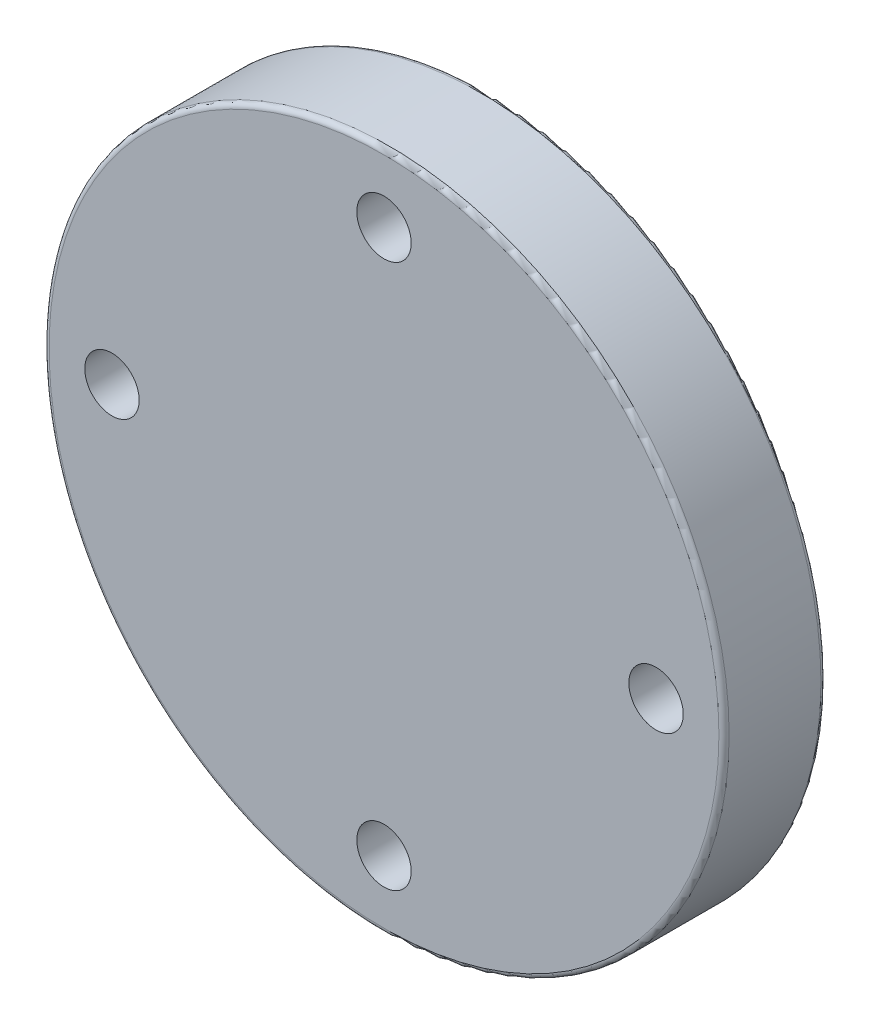
ISO-10303-21;
HEADER;
FILE_DESCRIPTION(('STEP AP214'),'2;1');
FILE_NAME('part.step','',(''),(''),'','','');
FILE_SCHEMA(('AUTOMOTIVE_DESIGN { 1 0 10303 214 1 1 1 1 }'));
ENDSEC;
DATA;
#1=APPLICATION_CONTEXT('core data for automotive mechanical design processes');
#2=APPLICATION_PROTOCOL_DEFINITION('international standard','automotive_design',2000,#1);
#3=PRODUCT_CONTEXT('',#1,'mechanical');
#4=PRODUCT('Part','Part','',(#3));
#5=PRODUCT_RELATED_PRODUCT_CATEGORY('part','',(#4));
#6=PRODUCT_DEFINITION_FORMATION('','',#4);
#7=PRODUCT_DEFINITION_CONTEXT('part definition',#1,'design');
#8=PRODUCT_DEFINITION('design','',#6,#7);
#9=PRODUCT_DEFINITION_SHAPE('','',#8);
#10=(LENGTH_UNIT() NAMED_UNIT(*) SI_UNIT(.MILLI.,.METRE.));
#11=(NAMED_UNIT(*) PLANE_ANGLE_UNIT() SI_UNIT($,.RADIAN.));
#12=(NAMED_UNIT(*) SI_UNIT($,.STERADIAN.) SOLID_ANGLE_UNIT());
#13=UNCERTAINTY_MEASURE_WITH_UNIT(LENGTH_MEASURE(1.E-05),#10,'distance_accuracy_value','');
#14=(GEOMETRIC_REPRESENTATION_CONTEXT(3) GLOBAL_UNCERTAINTY_ASSIGNED_CONTEXT((#13)) GLOBAL_UNIT_ASSIGNED_CONTEXT((#10,
#11,#12)) REPRESENTATION_CONTEXT('',''));
#15=CARTESIAN_POINT('',(0.,0.,0.));
#16=DIRECTION('',(0.,0.,1.));
#17=DIRECTION('',(1.,0.,0.));
#18=AXIS2_PLACEMENT_3D('',#15,#16,#17);
#19=CARTESIAN_POINT('',(0.,0.,5.));
#20=DIRECTION('',(0.,0.,-1.));
#21=DIRECTION('',(0.,-1.,0.));
#22=AXIS2_PLACEMENT_3D('',#19,#20,#21);
#23=PLANE('',#22);
#24=CARTESIAN_POINT('',(0.,0.,5.));
#25=DIRECTION('',(0.,0.,-1.));
#26=DIRECTION('',(-1.,0.,0.));
#27=AXIS2_PLACEMENT_3D('',#24,#25,#26);
#28=CIRCLE('',#27,12.);
#29=CARTESIAN_POINT('',(-12.,0.,5.));
#30=VERTEX_POINT('',#29);
#31=EDGE_CURVE('E132',#30,#30,#28,.T.);
#32=ORIENTED_EDGE('',*,*,#31,.T.);
#33=EDGE_LOOP('',(#32));
#34=FACE_BOUND('',#33,.T.);
#35=ADVANCED_FACE('F16',(#34),#23,.T.);
#36=CARTESIAN_POINT('',(0.,0.,-1.));
#37=DIRECTION('',(0.,0.,1.));
#38=DIRECTION('',(1.,0.,0.));
#39=AXIS2_PLACEMENT_3D('',#36,#37,#38);
#40=CONICAL_SURFACE('',#39,12.5,0.785398163397446);
#41=CARTESIAN_POINT('',(0.,0.,-1.));
#42=DIRECTION('',(0.,0.,-1.));
#43=DIRECTION('',(-1.,0.,0.));
#44=AXIS2_PLACEMENT_3D('',#41,#42,#43);
#45=CIRCLE('',#44,12.5);
#46=CARTESIAN_POINT('',(-12.5,0.,-1.));
#47=VERTEX_POINT('',#46);
#48=EDGE_CURVE('E11',#47,#47,#45,.T.);
#49=ORIENTED_EDGE('',*,*,#48,.F.);
#50=EDGE_LOOP('',(#49));
#51=FACE_BOUND('',#50,.T.);
#52=CARTESIAN_POINT('',(0.,0.,0.));
#53=DIRECTION('',(0.,0.,-1.));
#54=DIRECTION('',(-1.,0.,0.));
#55=AXIS2_PLACEMENT_3D('',#52,#53,#54);
#56=CIRCLE('',#55,13.5);
#57=CARTESIAN_POINT('',(-13.5,0.,0.));
#58=VERTEX_POINT('',#57);
#59=EDGE_CURVE('E53',#58,#58,#56,.T.);
#60=ORIENTED_EDGE('',*,*,#59,.T.);
#61=EDGE_LOOP('',(#60));
#62=FACE_BOUND('',#61,.T.);
#63=ADVANCED_FACE('F236',(#51,#62),#40,.T.);
#64=CARTESIAN_POINT('',(0.,0.,-1.));
#65=DIRECTION('',(0.,0.,-1.));
#66=DIRECTION('',(0.,-1.,0.));
#67=AXIS2_PLACEMENT_3D('',#64,#65,#66);
#68=PLANE('',#67);
#69=CARTESIAN_POINT('',(0.,0.,-1.));
#70=DIRECTION('',(0.,0.,-1.));
#71=DIRECTION('',(-1.,0.,0.));
#72=AXIS2_PLACEMENT_3D('',#69,#70,#71);
#73=CIRCLE('',#72,12.);
#74=CARTESIAN_POINT('',(-12.,0.,-1.));
#75=VERTEX_POINT('',#74);
#76=EDGE_CURVE('E27',#75,#75,#73,.T.);
#77=ORIENTED_EDGE('',*,*,#76,.F.);
#78=EDGE_LOOP('',(#77));
#79=FACE_BOUND('',#78,.T.);
#80=ORIENTED_EDGE('',*,*,#48,.T.);
#81=EDGE_LOOP('',(#80));
#82=FACE_BOUND('',#81,.T.);
#83=ADVANCED_FACE('F228',(#79,#82),#68,.T.);
#84=CARTESIAN_POINT('',(0.,0.,0.3));
#85=DIRECTION('',(0.,0.,1.));
#86=DIRECTION('',(1.,0.,0.));
#87=AXIS2_PLACEMENT_3D('',#84,#85,#86);
#88=TOROIDAL_SURFACE('',#87,19.7,0.3);
#89=CARTESIAN_POINT('',(0.,0.,0.3));
#90=DIRECTION('',(0.,0.,1.));
#91=DIRECTION('',(1.,0.,0.));
#92=AXIS2_PLACEMENT_3D('',#89,#90,#91);
#93=CIRCLE('',#92,20.);
#94=CARTESIAN_POINT('',(20.,0.,0.3));
#95=VERTEX_POINT('',#94);
#96=EDGE_CURVE('E141',#95,#95,#93,.T.);
#97=ORIENTED_EDGE('',*,*,#96,.F.);
#98=EDGE_LOOP('',(#97));
#99=FACE_BOUND('',#98,.T.);
#100=CARTESIAN_POINT('',(0.,0.,0.));
#101=DIRECTION('',(0.,0.,-1.));
#102=DIRECTION('',(1.,0.,0.));
#103=AXIS2_PLACEMENT_3D('',#100,#101,#102);
#104=CIRCLE('',#103,19.7);
#105=CARTESIAN_POINT('',(19.7,0.,0.));
#106=VERTEX_POINT('',#105);
#107=EDGE_CURVE('E20',#106,#106,#104,.T.);
#108=ORIENTED_EDGE('',*,*,#107,.F.);
#109=EDGE_LOOP('',(#108));
#110=FACE_BOUND('',#109,.T.);
#111=ADVANCED_FACE('F18',(#99,#110),#88,.T.);
#112=CARTESIAN_POINT('',(0.,0.,5.7));
#113=DIRECTION('',(0.,0.,1.));
#114=DIRECTION('',(1.,0.,0.));
#115=AXIS2_PLACEMENT_3D('',#112,#113,#114);
#116=TOROIDAL_SURFACE('',#115,19.7,0.3);
#117=CARTESIAN_POINT('',(0.,0.,6.));
#118=DIRECTION('',(0.,0.,1.));
#119=DIRECTION('',(1.,0.,0.));
#120=AXIS2_PLACEMENT_3D('',#117,#118,#119);
#121=CIRCLE('',#120,19.7);
#122=CARTESIAN_POINT('',(19.7,0.,6.));
#123=VERTEX_POINT('',#122);
#124=EDGE_CURVE('E134',#123,#123,#121,.T.);
#125=ORIENTED_EDGE('',*,*,#124,.F.);
#126=EDGE_LOOP('',(#125));
#127=FACE_BOUND('',#126,.T.);
#128=CARTESIAN_POINT('',(0.,0.,5.7));
#129=DIRECTION('',(0.,0.,-1.));
#130=DIRECTION('',(1.,0.,0.));
#131=AXIS2_PLACEMENT_3D('',#128,#129,#130);
#132=CIRCLE('',#131,20.);
#133=CARTESIAN_POINT('',(20.,0.,5.7));
#134=VERTEX_POINT('',#133);
#135=EDGE_CURVE('E125',#134,#134,#132,.T.);
#136=ORIENTED_EDGE('',*,*,#135,.F.);
#137=EDGE_LOOP('',(#136));
#138=FACE_BOUND('',#137,.T.);
#139=ADVANCED_FACE('F227',(#127,#138),#116,.T.);
#140=CARTESIAN_POINT('',(0.,16.,5.));
#141=DIRECTION('',(0.,0.,-1.));
#142=DIRECTION('',(-1.,0.,0.));
#143=AXIS2_PLACEMENT_3D('',#140,#141,#142);
#144=CYLINDRICAL_SURFACE('',#143,1.6);
#145=CARTESIAN_POINT('',(0.,16.,0.));
#146=DIRECTION('',(0.,0.,-1.));
#147=DIRECTION('',(-1.,0.,0.));
#148=AXIS2_PLACEMENT_3D('',#145,#146,#147);
#149=CIRCLE('',#148,1.6);
#150=CARTESIAN_POINT('',(-1.6,16.,0.));
#151=VERTEX_POINT('',#150);
#152=EDGE_CURVE('E127',#151,#151,#149,.T.);
#153=ORIENTED_EDGE('',*,*,#152,.T.);
#154=EDGE_LOOP('',(#153));
#155=FACE_BOUND('',#154,.T.);
#156=CARTESIAN_POINT('',(0.,16.,6.));
#157=DIRECTION('',(0.,0.,-1.));
#158=DIRECTION('',(-1.,0.,0.));
#159=AXIS2_PLACEMENT_3D('',#156,#157,#158);
#160=CIRCLE('',#159,1.6);
#161=CARTESIAN_POINT('',(-1.6,16.,6.));
#162=VERTEX_POINT('',#161);
#163=EDGE_CURVE('E102',#162,#162,#160,.T.);
#164=ORIENTED_EDGE('',*,*,#163,.F.);
#165=EDGE_LOOP('',(#164));
#166=FACE_BOUND('',#165,.T.);
#167=ADVANCED_FACE('F252',(#155,#166),#144,.F.);
#168=CARTESIAN_POINT('',(-16.,4.49068668875334E-13,5.));
#169=DIRECTION('',(0.,0.,-1.));
#170=DIRECTION('',(-1.,0.,0.));
#171=AXIS2_PLACEMENT_3D('',#168,#169,#170);
#172=CYLINDRICAL_SURFACE('',#171,1.60000000000048);
#173=CARTESIAN_POINT('',(-16.,4.49068668875334E-13,0.));
#174=DIRECTION('',(0.,0.,-1.));
#175=DIRECTION('',(-1.,0.,0.));
#176=AXIS2_PLACEMENT_3D('',#173,#174,#175);
#177=CIRCLE('',#176,1.60000000000048);
#178=CARTESIAN_POINT('',(-17.6000000000005,4.49068668875334E-13,0.));
#179=VERTEX_POINT('',#178);
#180=EDGE_CURVE('E108',#179,#179,#177,.T.);
#181=ORIENTED_EDGE('',*,*,#180,.T.);
#182=EDGE_LOOP('',(#181));
#183=FACE_BOUND('',#182,.T.);
#184=CARTESIAN_POINT('',(-16.,4.49068668875334E-13,6.));
#185=DIRECTION('',(0.,0.,-1.));
#186=DIRECTION('',(-1.,0.,0.));
#187=AXIS2_PLACEMENT_3D('',#184,#185,#186);
#188=CIRCLE('',#187,1.60000000000048);
#189=CARTESIAN_POINT('',(-17.6000000000005,4.49068668875334E-13,6.));
#190=VERTEX_POINT('',#189);
#191=EDGE_CURVE('E93',#190,#190,#188,.T.);
#192=ORIENTED_EDGE('',*,*,#191,.F.);
#193=EDGE_LOOP('',(#192));
#194=FACE_BOUND('',#193,.T.);
#195=ADVANCED_FACE('F256',(#183,#194),#172,.F.);
#196=CARTESIAN_POINT('',(-4.58483142604494E-13,-15.9999999999995,5.));
#197=DIRECTION('',(0.,0.,-1.));
#198=DIRECTION('',(-1.,0.,0.));
#199=AXIS2_PLACEMENT_3D('',#196,#197,#198);
#200=CYLINDRICAL_SURFACE('',#199,1.60000000000068);
#201=CARTESIAN_POINT('',(-4.58483142604494E-13,-15.9999999999995,0.));
#202=DIRECTION('',(0.,0.,-1.));
#203=DIRECTION('',(-1.,0.,0.));
#204=AXIS2_PLACEMENT_3D('',#201,#202,#203);
#205=CIRCLE('',#204,1.60000000000068);
#206=CARTESIAN_POINT('',(-1.60000000000114,-15.9999999999995,0.));
#207=VERTEX_POINT('',#206);
#208=EDGE_CURVE('E113',#207,#207,#205,.T.);
#209=ORIENTED_EDGE('',*,*,#208,.T.);
#210=EDGE_LOOP('',(#209));
#211=FACE_BOUND('',#210,.T.);
#212=CARTESIAN_POINT('',(-4.58483142604494E-13,-15.9999999999995,6.));
#213=DIRECTION('',(0.,0.,-1.));
#214=DIRECTION('',(-1.,0.,0.));
#215=AXIS2_PLACEMENT_3D('',#212,#213,#214);
#216=CIRCLE('',#215,1.60000000000068);
#217=CARTESIAN_POINT('',(-1.60000000000114,-15.9999999999995,6.));
#218=VERTEX_POINT('',#217);
#219=EDGE_CURVE('E137',#218,#218,#216,.T.);
#220=ORIENTED_EDGE('',*,*,#219,.F.);
#221=EDGE_LOOP('',(#220));
#222=FACE_BOUND('',#221,.T.);
#223=ADVANCED_FACE('F114',(#211,#222),#200,.F.);
#224=CARTESIAN_POINT('',(15.9999999999995,0.,5.));
#225=DIRECTION('',(0.,0.,-1.));
#226=DIRECTION('',(-1.,0.,0.));
#227=AXIS2_PLACEMENT_3D('',#224,#225,#226);
#228=CYLINDRICAL_SURFACE('',#227,1.60000000000029);
#229=CARTESIAN_POINT('',(15.9999999999995,0.,0.));
#230=DIRECTION('',(0.,0.,-1.));
#231=DIRECTION('',(-1.,0.,0.));
#232=AXIS2_PLACEMENT_3D('',#229,#230,#231);
#233=CIRCLE('',#232,1.60000000000029);
#234=CARTESIAN_POINT('',(14.3999999999993,0.,0.));
#235=VERTEX_POINT('',#234);
#236=EDGE_CURVE('E118',#235,#235,#233,.T.);
#237=ORIENTED_EDGE('',*,*,#236,.T.);
#238=EDGE_LOOP('',(#237));
#239=FACE_BOUND('',#238,.T.);
#240=CARTESIAN_POINT('',(15.9999999999995,0.,6.));
#241=DIRECTION('',(0.,0.,-1.));
#242=DIRECTION('',(-1.,0.,0.));
#243=AXIS2_PLACEMENT_3D('',#240,#241,#242);
#244=CIRCLE('',#243,1.60000000000029);
#245=CARTESIAN_POINT('',(14.3999999999993,0.,6.));
#246=VERTEX_POINT('',#245);
#247=EDGE_CURVE('E65',#246,#246,#244,.T.);
#248=ORIENTED_EDGE('',*,*,#247,.F.);
#249=EDGE_LOOP('',(#248));
#250=FACE_BOUND('',#249,.T.);
#251=ADVANCED_FACE('F262',(#239,#250),#228,.F.);
#252=CARTESIAN_POINT('',(0.,0.,5.));
#253=DIRECTION('',(0.,0.,-1.));
#254=DIRECTION('',(-1.,0.,0.));
#255=AXIS2_PLACEMENT_3D('',#252,#253,#254);
#256=CYLINDRICAL_SURFACE('',#255,12.);
#257=ORIENTED_EDGE('',*,*,#76,.T.);
#258=EDGE_LOOP('',(#257));
#259=FACE_BOUND('',#258,.T.);
#260=ORIENTED_EDGE('',*,*,#31,.F.);
#261=EDGE_LOOP('',(#260));
#262=FACE_BOUND('',#261,.T.);
#263=ADVANCED_FACE('F246',(#259,#262),#256,.F.);
#264=CARTESIAN_POINT('',(0.,0.,5.));
#265=DIRECTION('',(0.,0.,-1.));
#266=DIRECTION('',(-1.,0.,0.));
#267=AXIS2_PLACEMENT_3D('',#264,#265,#266);
#268=CYLINDRICAL_SURFACE('',#267,20.);
#269=ORIENTED_EDGE('',*,*,#96,.T.);
#270=EDGE_LOOP('',(#269));
#271=FACE_BOUND('',#270,.T.);
#272=ORIENTED_EDGE('',*,*,#135,.T.);
#273=EDGE_LOOP('',(#272));
#274=FACE_BOUND('',#273,.T.);
#275=ADVANCED_FACE('F241',(#271,#274),#268,.T.);
#276=CARTESIAN_POINT('',(0.,0.,0.));
#277=DIRECTION('',(0.,0.,1.));
#278=DIRECTION('',(1.,0.,0.));
#279=AXIS2_PLACEMENT_3D('',#276,#277,#278);
#280=PLANE('',#279);
#281=ORIENTED_EDGE('',*,*,#236,.F.);
#282=EDGE_LOOP('',(#281));
#283=FACE_BOUND('',#282,.T.);
#284=ORIENTED_EDGE('',*,*,#208,.F.);
#285=EDGE_LOOP('',(#284));
#286=FACE_BOUND('',#285,.T.);
#287=ORIENTED_EDGE('',*,*,#180,.F.);
#288=EDGE_LOOP('',(#287));
#289=FACE_BOUND('',#288,.T.);
#290=ORIENTED_EDGE('',*,*,#152,.F.);
#291=EDGE_LOOP('',(#290));
#292=FACE_BOUND('',#291,.T.);
#293=ORIENTED_EDGE('',*,*,#107,.T.);
#294=EDGE_LOOP('',(#293));
#295=FACE_BOUND('',#294,.T.);
#296=ORIENTED_EDGE('',*,*,#59,.F.);
#297=EDGE_LOOP('',(#296));
#298=FACE_BOUND('',#297,.T.);
#299=ADVANCED_FACE('F245',(#283,#286,#289,#292,#295,#298),#280,.F.);
#300=CARTESIAN_POINT('',(0.,0.,6.));
#301=DIRECTION('',(0.,0.,1.));
#302=DIRECTION('',(1.,0.,0.));
#303=AXIS2_PLACEMENT_3D('',#300,#301,#302);
#304=PLANE('',#303);
#305=ORIENTED_EDGE('',*,*,#247,.T.);
#306=EDGE_LOOP('',(#305));
#307=FACE_BOUND('',#306,.T.);
#308=ORIENTED_EDGE('',*,*,#219,.T.);
#309=EDGE_LOOP('',(#308));
#310=FACE_BOUND('',#309,.T.);
#311=ORIENTED_EDGE('',*,*,#191,.T.);
#312=EDGE_LOOP('',(#311));
#313=FACE_BOUND('',#312,.T.);
#314=ORIENTED_EDGE('',*,*,#163,.T.);
#315=EDGE_LOOP('',(#314));
#316=FACE_BOUND('',#315,.T.);
#317=ORIENTED_EDGE('',*,*,#124,.T.);
#318=EDGE_LOOP('',(#317));
#319=FACE_BOUND('',#318,.T.);
#320=ADVANCED_FACE('F271',(#307,#310,#313,#316,#319),#304,.T.);
#321=CLOSED_SHELL('',(#35,#63,#83,#111,#139,#167,#195,#223,#251,#263,#275,#299,#320));
#322=MANIFOLD_SOLID_BREP('B1',#321);
#323=ADVANCED_BREP_SHAPE_REPRESENTATION('',(#18,#322),#14);
#324=SHAPE_DEFINITION_REPRESENTATION(#9,#323);
ENDSEC;
END-ISO-10303-21;
